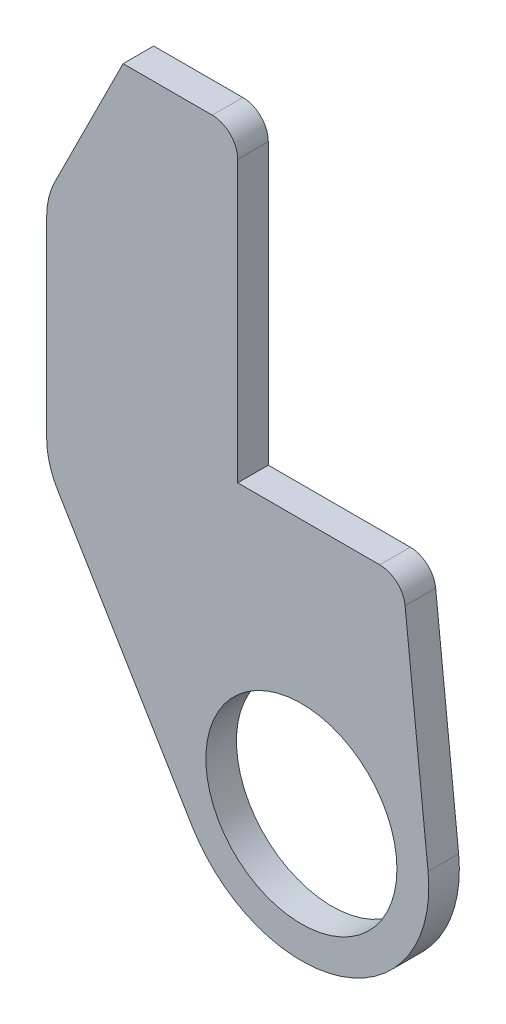
ISO-10303-21;
HEADER;
FILE_DESCRIPTION(('STEP AP214'),'2;1');
FILE_NAME('part.step','',(''),(''),'','','');
FILE_SCHEMA(('AUTOMOTIVE_DESIGN { 1 0 10303 214 1 1 1 1 }'));
ENDSEC;
DATA;
#1=APPLICATION_CONTEXT('core data for automotive mechanical design processes');
#2=APPLICATION_PROTOCOL_DEFINITION('international standard','automotive_design',2000,#1);
#3=PRODUCT_CONTEXT('',#1,'mechanical');
#4=PRODUCT('Part','Part','',(#3));
#5=PRODUCT_RELATED_PRODUCT_CATEGORY('part','',(#4));
#6=PRODUCT_DEFINITION_FORMATION('','',#4);
#7=PRODUCT_DEFINITION_CONTEXT('part definition',#1,'design');
#8=PRODUCT_DEFINITION('design','',#6,#7);
#9=PRODUCT_DEFINITION_SHAPE('','',#8);
#10=(LENGTH_UNIT() NAMED_UNIT(*) SI_UNIT(.MILLI.,.METRE.));
#11=(NAMED_UNIT(*) PLANE_ANGLE_UNIT() SI_UNIT($,.RADIAN.));
#12=(NAMED_UNIT(*) SI_UNIT($,.STERADIAN.) SOLID_ANGLE_UNIT());
#13=UNCERTAINTY_MEASURE_WITH_UNIT(LENGTH_MEASURE(1.E-05),#10,'distance_accuracy_value','');
#14=(GEOMETRIC_REPRESENTATION_CONTEXT(3) GLOBAL_UNCERTAINTY_ASSIGNED_CONTEXT((#13)) GLOBAL_UNIT_ASSIGNED_CONTEXT((#10,
#11,#12)) REPRESENTATION_CONTEXT('',''));
#15=CARTESIAN_POINT('',(0.,0.,0.));
#16=DIRECTION('',(0.,0.,1.));
#17=DIRECTION('',(1.,0.,0.));
#18=AXIS2_PLACEMENT_3D('',#15,#16,#17);
#19=CARTESIAN_POINT('',(0.,0.,12.));
#20=DIRECTION('',(0.,0.,1.));
#21=DIRECTION('',(1.,0.,0.));
#22=AXIS2_PLACEMENT_3D('',#19,#20,#21);
#23=PLANE('',#22);
#24=DIRECTION('',(-0.447213595499958,-0.894427190999916,0.));
#25=VECTOR('',#24,1.);
#26=CARTESIAN_POINT('',(-100.,160.,12.));
#27=LINE('',#26,#25);
#28=CARTESIAN_POINT('',(-70.,220.,12.));
#29=VERTEX_POINT('',#28);
#30=CARTESIAN_POINT('',(-96.8328157299975,166.334368540005,12.));
#31=VERTEX_POINT('',#30);
#32=EDGE_CURVE('E191',#29,#31,#27,.T.);
#33=ORIENTED_EDGE('',*,*,#32,.T.);
#34=CARTESIAN_POINT('',(-70.,152.917960675006,12.));
#35=DIRECTION('',(0.,0.,1.));
#36=DIRECTION('',(1.,0.,0.));
#37=AXIS2_PLACEMENT_3D('',#34,#35,#36);
#38=CIRCLE('',#37,30.);
#39=CARTESIAN_POINT('',(-100.,152.917960675006,12.));
#40=VERTEX_POINT('',#39);
#41=EDGE_CURVE('E46',#31,#40,#38,.T.);
#42=ORIENTED_EDGE('',*,*,#41,.T.);
#43=DIRECTION('',(0.,-1.,0.));
#44=VECTOR('',#43,1.);
#45=CARTESIAN_POINT('',(-100.,69.3477469145337,12.));
#46=LINE('',#45,#44);
#47=CARTESIAN_POINT('',(-100.,77.6674832363289,12.));
#48=VERTEX_POINT('',#47);
#49=EDGE_CURVE('E190',#40,#48,#46,.T.);
#50=ORIENTED_EDGE('',*,*,#49,.T.);
#51=CARTESIAN_POINT('',(-70.,77.6674832363289,12.));
#52=DIRECTION('',(0.,0.,1.));
#53=DIRECTION('',(1.,0.,0.));
#54=AXIS2_PLACEMENT_3D('',#51,#52,#53);
#55=CIRCLE('',#54,30.);
#56=CARTESIAN_POINT('',(-95.7150190210634,62.2163409890272,12.));
#57=VERTEX_POINT('',#56);
#58=EDGE_CURVE('E53',#48,#57,#55,.T.);
#59=ORIENTED_EDGE('',*,*,#58,.T.);
#60=DIRECTION('',(0.515038074910055,-0.857167300702112,0.));
#61=VECTOR('',#60,1.);
#62=CARTESIAN_POINT('',(-42.8583650351056,-25.7519037455028,12.));
#63=LINE('',#62,#61);
#64=CARTESIAN_POINT('',(-42.8583650351056,-25.7519037455028,12.));
#65=VERTEX_POINT('',#64);
#66=EDGE_CURVE('E145',#57,#65,#63,.T.);
#67=ORIENTED_EDGE('',*,*,#66,.T.);
#68=CARTESIAN_POINT('',(0.,0.,12.));
#69=DIRECTION('',(0.,0.,1.));
#70=DIRECTION('',(1.,0.,0.));
#71=AXIS2_PLACEMENT_3D('',#68,#69,#70);
#72=CIRCLE('',#71,50.);
#73=CARTESIAN_POINT('',(49.7260947684137,5.22642316338272,12.));
#74=VERTEX_POINT('',#73);
#75=EDGE_CURVE('E141',#65,#74,#72,.T.);
#76=ORIENTED_EDGE('',*,*,#75,.T.);
#77=DIRECTION('',(-0.104528463267654,0.994521895368273,0.));
#78=VECTOR('',#77,1.);
#79=CARTESIAN_POINT('',(39.7649904516081,100.,12.));
#80=LINE('',#79,#78);
#81=CARTESIAN_POINT('',(40.7061689623124,91.0452846326766,12.));
#82=VERTEX_POINT('',#81);
#83=EDGE_CURVE('E130',#74,#82,#80,.T.);
#84=ORIENTED_EDGE('',*,*,#83,.T.);
#85=CARTESIAN_POINT('',(30.7609500086297,90.,12.));
#86=DIRECTION('',(0.,0.,1.));
#87=DIRECTION('',(1.,0.,0.));
#88=AXIS2_PLACEMENT_3D('',#85,#86,#87);
#89=CIRCLE('',#88,10.);
#90=CARTESIAN_POINT('',(30.7609500086297,100.,12.));
#91=VERTEX_POINT('',#90);
#92=EDGE_CURVE('E170',#82,#91,#89,.T.);
#93=ORIENTED_EDGE('',*,*,#92,.T.);
#94=DIRECTION('',(-1.,0.,0.));
#95=VECTOR('',#94,1.);
#96=CARTESIAN_POINT('',(-25.,100.,12.));
#97=LINE('',#96,#95);
#98=CARTESIAN_POINT('',(-25.,100.,12.));
#99=VERTEX_POINT('',#98);
#100=EDGE_CURVE('E140',#91,#99,#97,.T.);
#101=ORIENTED_EDGE('',*,*,#100,.T.);
#102=DIRECTION('',(0.,1.,0.));
#103=VECTOR('',#102,1.);
#104=CARTESIAN_POINT('',(-25.,220.,12.));
#105=LINE('',#104,#103);
#106=CARTESIAN_POINT('',(-25.,210.,12.));
#107=VERTEX_POINT('',#106);
#108=EDGE_CURVE('E243',#99,#107,#105,.T.);
#109=ORIENTED_EDGE('',*,*,#108,.T.);
#110=CARTESIAN_POINT('',(-35.,210.,12.));
#111=DIRECTION('',(0.,0.,1.));
#112=DIRECTION('',(1.,0.,0.));
#113=AXIS2_PLACEMENT_3D('',#110,#111,#112);
#114=CIRCLE('',#113,10.);
#115=CARTESIAN_POINT('',(-35.,220.,12.));
#116=VERTEX_POINT('',#115);
#117=EDGE_CURVE('E172',#107,#116,#114,.T.);
#118=ORIENTED_EDGE('',*,*,#117,.T.);
#119=DIRECTION('',(-1.,0.,0.));
#120=VECTOR('',#119,1.);
#121=CARTESIAN_POINT('',(-70.,220.,12.));
#122=LINE('',#121,#120);
#123=EDGE_CURVE('E242',#116,#29,#122,.T.);
#124=ORIENTED_EDGE('',*,*,#123,.T.);
#125=EDGE_LOOP('',(#33,#42,#50,#59,#67,#76,#84,#93,#101,#109,#118,#124));
#126=FACE_BOUND('',#125,.T.);
#127=CARTESIAN_POINT('',(0.,0.,12.));
#128=DIRECTION('',(0.,0.,1.));
#129=DIRECTION('',(1.,0.,0.));
#130=AXIS2_PLACEMENT_3D('',#127,#128,#129);
#131=CIRCLE('',#130,37.5);
#132=CARTESIAN_POINT('',(37.5,0.,12.));
#133=VERTEX_POINT('',#132);
#134=EDGE_CURVE('E225',#133,#133,#131,.T.);
#135=ORIENTED_EDGE('',*,*,#134,.F.);
#136=EDGE_LOOP('',(#135));
#137=FACE_BOUND('',#136,.T.);
#138=ADVANCED_FACE('F38',(#126,#137),#23,.T.);
#139=CARTESIAN_POINT('',(0.,0.,0.));
#140=DIRECTION('',(0.,0.,1.));
#141=DIRECTION('',(1.,0.,0.));
#142=AXIS2_PLACEMENT_3D('',#139,#140,#141);
#143=PLANE('',#142);
#144=DIRECTION('',(0.,-1.,0.));
#145=VECTOR('',#144,1.);
#146=CARTESIAN_POINT('',(-100.,69.3477469145337,0.));
#147=LINE('',#146,#145);
#148=CARTESIAN_POINT('',(-100.,152.917960675006,0.));
#149=VERTEX_POINT('',#148);
#150=CARTESIAN_POINT('',(-100.,77.6674832363289,0.));
#151=VERTEX_POINT('',#150);
#152=EDGE_CURVE('E207',#149,#151,#147,.T.);
#153=ORIENTED_EDGE('',*,*,#152,.F.);
#154=CARTESIAN_POINT('',(-70.,152.917960675006,0.));
#155=DIRECTION('',(0.,0.,1.));
#156=DIRECTION('',(1.,0.,0.));
#157=AXIS2_PLACEMENT_3D('',#154,#155,#156);
#158=CIRCLE('',#157,30.);
#159=CARTESIAN_POINT('',(-96.8328157299975,166.334368540005,0.));
#160=VERTEX_POINT('',#159);
#161=EDGE_CURVE('E185',#149,#160,#158,.F.);
#162=ORIENTED_EDGE('',*,*,#161,.T.);
#163=DIRECTION('',(-0.447213595499958,-0.894427190999916,0.));
#164=VECTOR('',#163,1.);
#165=CARTESIAN_POINT('',(-100.,160.,0.));
#166=LINE('',#165,#164);
#167=CARTESIAN_POINT('',(-70.,220.,0.));
#168=VERTEX_POINT('',#167);
#169=EDGE_CURVE('E206',#168,#160,#166,.T.);
#170=ORIENTED_EDGE('',*,*,#169,.F.);
#171=DIRECTION('',(-1.,0.,0.));
#172=VECTOR('',#171,1.);
#173=CARTESIAN_POINT('',(-70.,220.,0.));
#174=LINE('',#173,#172);
#175=CARTESIAN_POINT('',(-35.,220.,0.));
#176=VERTEX_POINT('',#175);
#177=EDGE_CURVE('E211',#176,#168,#174,.T.);
#178=ORIENTED_EDGE('',*,*,#177,.F.);
#179=CARTESIAN_POINT('',(-35.,210.,0.));
#180=DIRECTION('',(0.,0.,1.));
#181=DIRECTION('',(1.,0.,0.));
#182=AXIS2_PLACEMENT_3D('',#179,#180,#181);
#183=CIRCLE('',#182,10.);
#184=CARTESIAN_POINT('',(-25.,210.,0.));
#185=VERTEX_POINT('',#184);
#186=EDGE_CURVE('E166',#176,#185,#183,.F.);
#187=ORIENTED_EDGE('',*,*,#186,.T.);
#188=DIRECTION('',(0.,1.,0.));
#189=VECTOR('',#188,1.);
#190=CARTESIAN_POINT('',(-25.,220.,0.));
#191=LINE('',#190,#189);
#192=CARTESIAN_POINT('',(-25.,100.,0.));
#193=VERTEX_POINT('',#192);
#194=EDGE_CURVE('E214',#193,#185,#191,.T.);
#195=ORIENTED_EDGE('',*,*,#194,.F.);
#196=DIRECTION('',(-1.,0.,0.));
#197=VECTOR('',#196,1.);
#198=CARTESIAN_POINT('',(-25.,100.,0.));
#199=LINE('',#198,#197);
#200=CARTESIAN_POINT('',(30.7609500086297,100.,0.));
#201=VERTEX_POINT('',#200);
#202=EDGE_CURVE('E227',#201,#193,#199,.T.);
#203=ORIENTED_EDGE('',*,*,#202,.F.);
#204=CARTESIAN_POINT('',(30.7609500086297,90.,0.));
#205=DIRECTION('',(0.,0.,1.));
#206=DIRECTION('',(1.,0.,0.));
#207=AXIS2_PLACEMENT_3D('',#204,#205,#206);
#208=CIRCLE('',#207,10.);
#209=CARTESIAN_POINT('',(40.7061689623124,91.0452846326766,0.));
#210=VERTEX_POINT('',#209);
#211=EDGE_CURVE('E158',#201,#210,#208,.F.);
#212=ORIENTED_EDGE('',*,*,#211,.T.);
#213=DIRECTION('',(-0.104528463267654,0.994521895368273,0.));
#214=VECTOR('',#213,1.);
#215=CARTESIAN_POINT('',(39.7649904516081,100.,0.));
#216=LINE('',#215,#214);
#217=CARTESIAN_POINT('',(49.7260947684137,5.22642316338272,0.));
#218=VERTEX_POINT('',#217);
#219=EDGE_CURVE('E224',#218,#210,#216,.T.);
#220=ORIENTED_EDGE('',*,*,#219,.F.);
#221=CARTESIAN_POINT('',(0.,0.,0.));
#222=DIRECTION('',(0.,0.,1.));
#223=DIRECTION('',(1.,0.,0.));
#224=AXIS2_PLACEMENT_3D('',#221,#222,#223);
#225=CIRCLE('',#224,50.);
#226=CARTESIAN_POINT('',(-42.8583650351056,-25.7519037455028,0.));
#227=VERTEX_POINT('',#226);
#228=EDGE_CURVE('E153',#227,#218,#225,.T.);
#229=ORIENTED_EDGE('',*,*,#228,.F.);
#230=DIRECTION('',(0.515038074910055,-0.857167300702112,0.));
#231=VECTOR('',#230,1.);
#232=CARTESIAN_POINT('',(-42.8583650351056,-25.7519037455028,0.));
#233=LINE('',#232,#231);
#234=CARTESIAN_POINT('',(-95.7150190210634,62.2163409890272,0.));
#235=VERTEX_POINT('',#234);
#236=EDGE_CURVE('E149',#235,#227,#233,.T.);
#237=ORIENTED_EDGE('',*,*,#236,.F.);
#238=CARTESIAN_POINT('',(-70.,77.6674832363289,0.));
#239=DIRECTION('',(0.,0.,1.));
#240=DIRECTION('',(1.,0.,0.));
#241=AXIS2_PLACEMENT_3D('',#238,#239,#240);
#242=CIRCLE('',#241,30.);
#243=EDGE_CURVE('E183',#235,#151,#242,.F.);
#244=ORIENTED_EDGE('',*,*,#243,.T.);
#245=EDGE_LOOP('',(#153,#162,#170,#178,#187,#195,#203,#212,#220,#229,#237,#244));
#246=FACE_BOUND('',#245,.T.);
#247=CARTESIAN_POINT('',(0.,0.,0.));
#248=DIRECTION('',(0.,0.,1.));
#249=DIRECTION('',(1.,0.,0.));
#250=AXIS2_PLACEMENT_3D('',#247,#248,#249);
#251=CIRCLE('',#250,37.5);
#252=CARTESIAN_POINT('',(37.5,0.,0.));
#253=VERTEX_POINT('',#252);
#254=EDGE_CURVE('E250',#253,#253,#251,.T.);
#255=ORIENTED_EDGE('',*,*,#254,.T.);
#256=EDGE_LOOP('',(#255));
#257=FACE_BOUND('',#256,.T.);
#258=ADVANCED_FACE('F203',(#246,#257),#143,.F.);
#259=CARTESIAN_POINT('',(0.,0.,12.));
#260=DIRECTION('',(0.,0.,-1.));
#261=DIRECTION('',(-1.,0.,0.));
#262=AXIS2_PLACEMENT_3D('',#259,#260,#261);
#263=CYLINDRICAL_SURFACE('',#262,50.);
#264=ORIENTED_EDGE('',*,*,#228,.T.);
#265=DIRECTION('',(0.,0.,-1.));
#266=VECTOR('',#265,1.);
#267=CARTESIAN_POINT('',(49.7260947684137,5.22642316338272,12.));
#268=LINE('',#267,#266);
#269=EDGE_CURVE('E135',#74,#218,#268,.T.);
#270=ORIENTED_EDGE('',*,*,#269,.F.);
#271=ORIENTED_EDGE('',*,*,#75,.F.);
#272=DIRECTION('',(0.,0.,-1.));
#273=VECTOR('',#272,1.);
#274=CARTESIAN_POINT('',(-42.8583650351056,-25.7519037455028,12.));
#275=LINE('',#274,#273);
#276=EDGE_CURVE('E219',#65,#227,#275,.T.);
#277=ORIENTED_EDGE('',*,*,#276,.T.);
#278=EDGE_LOOP('',(#264,#270,#271,#277));
#279=FACE_BOUND('',#278,.T.);
#280=ADVANCED_FACE('F151',(#279),#263,.T.);
#281=CARTESIAN_POINT('',(39.7649904516081,100.,12.));
#282=DIRECTION('',(-0.994521895368273,-0.104528463267654,0.));
#283=DIRECTION('',(0.104528463267655,-0.994521895368273,0.));
#284=AXIS2_PLACEMENT_3D('',#281,#282,#283);
#285=PLANE('',#284);
#286=ORIENTED_EDGE('',*,*,#219,.T.);
#287=DIRECTION('',(0.,0.,-1.));
#288=VECTOR('',#287,1.);
#289=CARTESIAN_POINT('',(40.7061689623124,91.0452846326766,12.));
#290=LINE('',#289,#288);
#291=EDGE_CURVE('E138',#210,#82,#290,.F.);
#292=ORIENTED_EDGE('',*,*,#291,.T.);
#293=ORIENTED_EDGE('',*,*,#83,.F.);
#294=ORIENTED_EDGE('',*,*,#269,.T.);
#295=EDGE_LOOP('',(#286,#292,#293,#294));
#296=FACE_BOUND('',#295,.T.);
#297=ADVANCED_FACE('F133',(#296),#285,.F.);
#298=CARTESIAN_POINT('',(-25.,100.,12.));
#299=DIRECTION('',(0.,-1.,0.));
#300=DIRECTION('',(0.,0.,-1.));
#301=AXIS2_PLACEMENT_3D('',#298,#299,#300);
#302=PLANE('',#301);
#303=ORIENTED_EDGE('',*,*,#100,.F.);
#304=DIRECTION('',(0.,0.,-1.));
#305=VECTOR('',#304,1.);
#306=CARTESIAN_POINT('',(30.7609500086297,100.,12.));
#307=LINE('',#306,#305);
#308=EDGE_CURVE('E174',#91,#201,#307,.T.);
#309=ORIENTED_EDGE('',*,*,#308,.T.);
#310=ORIENTED_EDGE('',*,*,#202,.T.);
#311=DIRECTION('',(0.,0.,-1.));
#312=VECTOR('',#311,1.);
#313=CARTESIAN_POINT('',(-25.,100.,12.));
#314=LINE('',#313,#312);
#315=EDGE_CURVE('E155',#99,#193,#314,.T.);
#316=ORIENTED_EDGE('',*,*,#315,.F.);
#317=EDGE_LOOP('',(#303,#309,#310,#316));
#318=FACE_BOUND('',#317,.T.);
#319=ADVANCED_FACE('F278',(#318),#302,.F.);
#320=CARTESIAN_POINT('',(-25.,220.,12.));
#321=DIRECTION('',(-1.,0.,0.));
#322=DIRECTION('',(0.,-1.,0.));
#323=AXIS2_PLACEMENT_3D('',#320,#321,#322);
#324=PLANE('',#323);
#325=ORIENTED_EDGE('',*,*,#194,.T.);
#326=DIRECTION('',(0.,0.,-1.));
#327=VECTOR('',#326,1.);
#328=CARTESIAN_POINT('',(-25.,210.,12.));
#329=LINE('',#328,#327);
#330=EDGE_CURVE('E168',#185,#107,#329,.F.);
#331=ORIENTED_EDGE('',*,*,#330,.T.);
#332=ORIENTED_EDGE('',*,*,#108,.F.);
#333=ORIENTED_EDGE('',*,*,#315,.T.);
#334=EDGE_LOOP('',(#325,#331,#332,#333));
#335=FACE_BOUND('',#334,.T.);
#336=ADVANCED_FACE('F232',(#335),#324,.F.);
#337=CARTESIAN_POINT('',(-70.,220.,12.));
#338=DIRECTION('',(0.,-1.,0.));
#339=DIRECTION('',(0.,0.,-1.));
#340=AXIS2_PLACEMENT_3D('',#337,#338,#339);
#341=PLANE('',#340);
#342=ORIENTED_EDGE('',*,*,#123,.F.);
#343=DIRECTION('',(0.,0.,-1.));
#344=VECTOR('',#343,1.);
#345=CARTESIAN_POINT('',(-35.,220.,12.));
#346=LINE('',#345,#344);
#347=EDGE_CURVE('E154',#116,#176,#346,.T.);
#348=ORIENTED_EDGE('',*,*,#347,.T.);
#349=ORIENTED_EDGE('',*,*,#177,.T.);
#350=DIRECTION('',(0.,0.,-1.));
#351=VECTOR('',#350,1.);
#352=CARTESIAN_POINT('',(-70.,220.,12.));
#353=LINE('',#352,#351);
#354=EDGE_CURVE('E161',#29,#168,#353,.T.);
#355=ORIENTED_EDGE('',*,*,#354,.F.);
#356=EDGE_LOOP('',(#342,#348,#349,#355));
#357=FACE_BOUND('',#356,.T.);
#358=ADVANCED_FACE('F245',(#357),#341,.F.);
#359=CARTESIAN_POINT('',(-100.,160.,12.));
#360=DIRECTION('',(0.894427190999916,-0.447213595499958,0.));
#361=DIRECTION('',(0.447213595499958,0.894427190999916,0.));
#362=AXIS2_PLACEMENT_3D('',#359,#360,#361);
#363=PLANE('',#362);
#364=ORIENTED_EDGE('',*,*,#169,.T.);
#365=DIRECTION('',(0.,0.,-1.));
#366=VECTOR('',#365,1.);
#367=CARTESIAN_POINT('',(-96.8328157299975,166.334368540005,12.));
#368=LINE('',#367,#366);
#369=EDGE_CURVE('E61',#160,#31,#368,.F.);
#370=ORIENTED_EDGE('',*,*,#369,.T.);
#371=ORIENTED_EDGE('',*,*,#32,.F.);
#372=ORIENTED_EDGE('',*,*,#354,.T.);
#373=EDGE_LOOP('',(#364,#370,#371,#372));
#374=FACE_BOUND('',#373,.T.);
#375=ADVANCED_FACE('F209',(#374),#363,.F.);
#376=CARTESIAN_POINT('',(-100.,69.3477469145337,12.));
#377=DIRECTION('',(1.,0.,0.));
#378=DIRECTION('',(0.,0.,-1.));
#379=AXIS2_PLACEMENT_3D('',#376,#377,#378);
#380=PLANE('',#379);
#381=ORIENTED_EDGE('',*,*,#49,.F.);
#382=DIRECTION('',(0.,0.,-1.));
#383=VECTOR('',#382,1.);
#384=CARTESIAN_POINT('',(-100.,152.917960675006,12.));
#385=LINE('',#384,#383);
#386=EDGE_CURVE('E180',#40,#149,#385,.T.);
#387=ORIENTED_EDGE('',*,*,#386,.T.);
#388=ORIENTED_EDGE('',*,*,#152,.T.);
#389=DIRECTION('',(0.,0.,-1.));
#390=VECTOR('',#389,1.);
#391=CARTESIAN_POINT('',(-100.,77.6674832363289,12.));
#392=LINE('',#391,#390);
#393=EDGE_CURVE('E178',#151,#48,#392,.F.);
#394=ORIENTED_EDGE('',*,*,#393,.T.);
#395=EDGE_LOOP('',(#381,#387,#388,#394));
#396=FACE_BOUND('',#395,.T.);
#397=ADVANCED_FACE('F195',(#396),#380,.F.);
#398=CARTESIAN_POINT('',(-42.8583650351056,-25.7519037455028,12.));
#399=DIRECTION('',(0.857167300702112,0.515038074910055,0.));
#400=DIRECTION('',(-0.515038074910055,0.857167300702112,0.));
#401=AXIS2_PLACEMENT_3D('',#398,#399,#400);
#402=PLANE('',#401);
#403=ORIENTED_EDGE('',*,*,#66,.F.);
#404=DIRECTION('',(0.,0.,-1.));
#405=VECTOR('',#404,1.);
#406=CARTESIAN_POINT('',(-95.7150190210634,62.2163409890272,12.));
#407=LINE('',#406,#405);
#408=EDGE_CURVE('E11',#57,#235,#407,.T.);
#409=ORIENTED_EDGE('',*,*,#408,.T.);
#410=ORIENTED_EDGE('',*,*,#236,.T.);
#411=ORIENTED_EDGE('',*,*,#276,.F.);
#412=EDGE_LOOP('',(#403,#409,#410,#411));
#413=FACE_BOUND('',#412,.T.);
#414=ADVANCED_FACE('F266',(#413),#402,.F.);
#415=CARTESIAN_POINT('',(0.,0.,12.));
#416=DIRECTION('',(0.,0.,-1.));
#417=DIRECTION('',(-1.,0.,0.));
#418=AXIS2_PLACEMENT_3D('',#415,#416,#417);
#419=CYLINDRICAL_SURFACE('',#418,37.5);
#420=ORIENTED_EDGE('',*,*,#134,.T.);
#421=EDGE_LOOP('',(#420));
#422=FACE_BOUND('',#421,.T.);
#423=ORIENTED_EDGE('',*,*,#254,.F.);
#424=EDGE_LOOP('',(#423));
#425=FACE_BOUND('',#424,.T.);
#426=ADVANCED_FACE('F256',(#422,#425),#419,.F.);
#427=CARTESIAN_POINT('',(-35.,210.,12.));
#428=DIRECTION('',(0.,0.,-1.));
#429=DIRECTION('',(-1.,0.,0.));
#430=AXIS2_PLACEMENT_3D('',#427,#428,#429);
#431=CYLINDRICAL_SURFACE('',#430,10.);
#432=ORIENTED_EDGE('',*,*,#117,.F.);
#433=ORIENTED_EDGE('',*,*,#330,.F.);
#434=ORIENTED_EDGE('',*,*,#186,.F.);
#435=ORIENTED_EDGE('',*,*,#347,.F.);
#436=EDGE_LOOP('',(#432,#433,#434,#435));
#437=FACE_BOUND('',#436,.T.);
#438=ADVANCED_FACE('F239',(#437),#431,.T.);
#439=CARTESIAN_POINT('',(30.7609500086297,90.,12.));
#440=DIRECTION('',(0.,0.,-1.));
#441=DIRECTION('',(-1.,0.,0.));
#442=AXIS2_PLACEMENT_3D('',#439,#440,#441);
#443=CYLINDRICAL_SURFACE('',#442,10.);
#444=ORIENTED_EDGE('',*,*,#92,.F.);
#445=ORIENTED_EDGE('',*,*,#291,.F.);
#446=ORIENTED_EDGE('',*,*,#211,.F.);
#447=ORIENTED_EDGE('',*,*,#308,.F.);
#448=EDGE_LOOP('',(#444,#445,#446,#447));
#449=FACE_BOUND('',#448,.T.);
#450=ADVANCED_FACE('F288',(#449),#443,.T.);
#451=CARTESIAN_POINT('',(-70.,152.917960675006,12.));
#452=DIRECTION('',(0.,0.,-1.));
#453=DIRECTION('',(-1.,0.,0.));
#454=AXIS2_PLACEMENT_3D('',#451,#452,#453);
#455=CYLINDRICAL_SURFACE('',#454,30.);
#456=ORIENTED_EDGE('',*,*,#41,.F.);
#457=ORIENTED_EDGE('',*,*,#369,.F.);
#458=ORIENTED_EDGE('',*,*,#161,.F.);
#459=ORIENTED_EDGE('',*,*,#386,.F.);
#460=EDGE_LOOP('',(#456,#457,#458,#459));
#461=FACE_BOUND('',#460,.T.);
#462=ADVANCED_FACE('F200',(#461),#455,.T.);
#463=CARTESIAN_POINT('',(-70.,77.6674832363289,12.));
#464=DIRECTION('',(0.,0.,-1.));
#465=DIRECTION('',(-1.,0.,0.));
#466=AXIS2_PLACEMENT_3D('',#463,#464,#465);
#467=CYLINDRICAL_SURFACE('',#466,30.);
#468=ORIENTED_EDGE('',*,*,#58,.F.);
#469=ORIENTED_EDGE('',*,*,#393,.F.);
#470=ORIENTED_EDGE('',*,*,#243,.F.);
#471=ORIENTED_EDGE('',*,*,#408,.F.);
#472=EDGE_LOOP('',(#468,#469,#470,#471));
#473=FACE_BOUND('',#472,.T.);
#474=ADVANCED_FACE('F40',(#473),#467,.T.);
#475=CLOSED_SHELL('',(#138,#258,#280,#297,#319,#336,#358,#375,#397,#414,#426,#438,#450,#462,#474));
#476=MANIFOLD_SOLID_BREP('B2',#475);
#477=ADVANCED_BREP_SHAPE_REPRESENTATION('',(#18,#476),#14);
#478=SHAPE_DEFINITION_REPRESENTATION(#9,#477);
ENDSEC;
END-ISO-10303-21;
